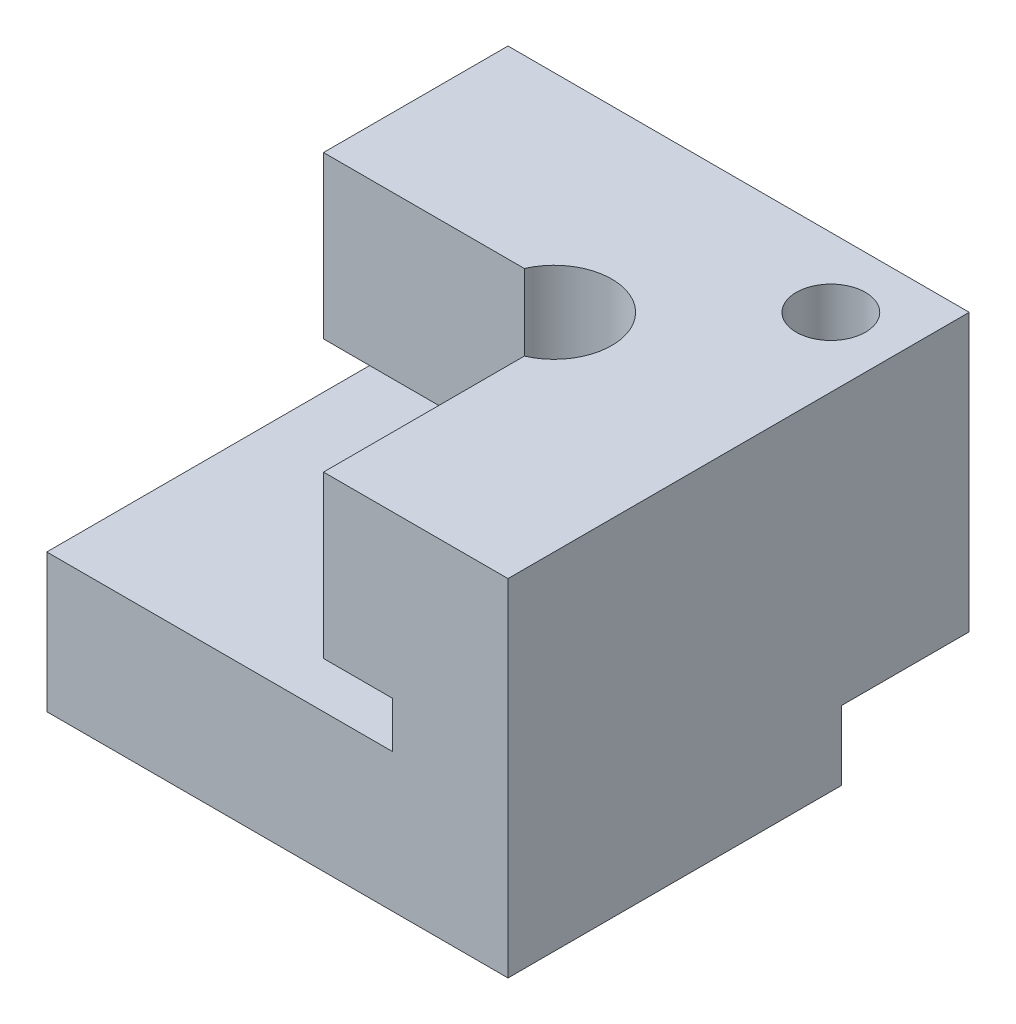
ISO-10303-21;
HEADER;
FILE_DESCRIPTION(('STEP AP214'),'2;1');
FILE_NAME('part.step','',(''),(''),'','','');
FILE_SCHEMA(('AUTOMOTIVE_DESIGN { 1 0 10303 214 1 1 1 1 }'));
ENDSEC;
DATA;
#1=APPLICATION_CONTEXT('core data for automotive mechanical design processes');
#2=APPLICATION_PROTOCOL_DEFINITION('international standard','automotive_design',2000,#1);
#3=PRODUCT_CONTEXT('',#1,'mechanical');
#4=PRODUCT('Part','Part','',(#3));
#5=PRODUCT_RELATED_PRODUCT_CATEGORY('part','',(#4));
#6=PRODUCT_DEFINITION_FORMATION('','',#4);
#7=PRODUCT_DEFINITION_CONTEXT('part definition',#1,'design');
#8=PRODUCT_DEFINITION('design','',#6,#7);
#9=PRODUCT_DEFINITION_SHAPE('','',#8);
#10=(LENGTH_UNIT() NAMED_UNIT(*) SI_UNIT(.MILLI.,.METRE.));
#11=(NAMED_UNIT(*) PLANE_ANGLE_UNIT() SI_UNIT($,.RADIAN.));
#12=(NAMED_UNIT(*) SI_UNIT($,.STERADIAN.) SOLID_ANGLE_UNIT());
#13=UNCERTAINTY_MEASURE_WITH_UNIT(LENGTH_MEASURE(1.E-05),#10,'distance_accuracy_value','');
#14=(GEOMETRIC_REPRESENTATION_CONTEXT(3) GLOBAL_UNCERTAINTY_ASSIGNED_CONTEXT((#13)) GLOBAL_UNIT_ASSIGNED_CONTEXT((#10,
#11,#12)) REPRESENTATION_CONTEXT('',''));
#15=CARTESIAN_POINT('',(0.,0.,0.));
#16=DIRECTION('',(0.,0.,1.));
#17=DIRECTION('',(1.,0.,0.));
#18=AXIS2_PLACEMENT_3D('',#15,#16,#17);
#19=CARTESIAN_POINT('',(17.,0.,-17.));
#20=DIRECTION('',(0.,1.,0.));
#21=DIRECTION('',(0.,0.,1.));
#22=AXIS2_PLACEMENT_3D('',#19,#20,#21);
#23=CYLINDRICAL_SURFACE('',#22,1.5);
#24=CARTESIAN_POINT('',(17.,15.,-17.));
#25=DIRECTION('',(0.,1.,0.));
#26=DIRECTION('',(0.,0.,1.));
#27=AXIS2_PLACEMENT_3D('',#24,#25,#26);
#28=CIRCLE('',#27,1.5);
#29=CARTESIAN_POINT('',(17.,15.,-15.5));
#30=VERTEX_POINT('',#29);
#31=EDGE_CURVE('E253',#30,#30,#28,.T.);
#32=ORIENTED_EDGE('',*,*,#31,.T.);
#33=EDGE_LOOP('',(#32));
#34=FACE_BOUND('',#33,.T.);
#35=CARTESIAN_POINT('',(17.,3.,-17.));
#36=DIRECTION('',(0.,-1.,0.));
#37=DIRECTION('',(0.,0.,-1.));
#38=AXIS2_PLACEMENT_3D('',#35,#36,#37);
#39=CIRCLE('',#38,1.5);
#40=CARTESIAN_POINT('',(17.,3.,-18.5));
#41=VERTEX_POINT('',#40);
#42=EDGE_CURVE('E43',#41,#41,#39,.F.);
#43=ORIENTED_EDGE('',*,*,#42,.F.);
#44=EDGE_LOOP('',(#43));
#45=FACE_BOUND('',#44,.T.);
#46=ADVANCED_FACE('F39',(#34,#45),#23,.F.);
#47=CARTESIAN_POINT('',(11.,0.,-11.));
#48=DIRECTION('',(0.,1.,0.));
#49=DIRECTION('',(0.,0.,1.));
#50=AXIS2_PLACEMENT_3D('',#47,#48,#49);
#51=CYLINDRICAL_SURFACE('',#50,1.5);
#52=CARTESIAN_POINT('',(11.,0.,-11.));
#53=DIRECTION('',(0.,1.,0.));
#54=DIRECTION('',(0.,0.,1.));
#55=AXIS2_PLACEMENT_3D('',#52,#53,#54);
#56=CIRCLE('',#55,1.5);
#57=CARTESIAN_POINT('',(11.,0.,-9.5));
#58=VERTEX_POINT('',#57);
#59=EDGE_CURVE('E254',#58,#58,#56,.T.);
#60=ORIENTED_EDGE('',*,*,#59,.F.);
#61=EDGE_LOOP('',(#60));
#62=FACE_BOUND('',#61,.T.);
#63=CARTESIAN_POINT('',(11.,3.,-11.));
#64=DIRECTION('',(0.,1.,0.));
#65=DIRECTION('',(0.,0.,1.));
#66=AXIS2_PLACEMENT_3D('',#63,#64,#65);
#67=CIRCLE('',#66,1.5);
#68=CARTESIAN_POINT('',(11.,3.,-9.5));
#69=VERTEX_POINT('',#68);
#70=EDGE_CURVE('E240',#69,#69,#67,.F.);
#71=ORIENTED_EDGE('',*,*,#70,.F.);
#72=EDGE_LOOP('',(#71));
#73=FACE_BOUND('',#72,.T.);
#74=ADVANCED_FACE('F366',(#62,#73),#51,.F.);
#75=CARTESIAN_POINT('',(0.,15.,0.));
#76=DIRECTION('',(1.,0.,0.));
#77=DIRECTION('',(0.,0.,-1.));
#78=AXIS2_PLACEMENT_3D('',#75,#76,#77);
#79=PLANE('',#78);
#80=DIRECTION('',(0.,0.,1.));
#81=VECTOR('',#80,1.);
#82=CARTESIAN_POINT('',(0.,6.,0.));
#83=LINE('',#82,#81);
#84=CARTESIAN_POINT('',(0.,6.,-15.));
#85=VERTEX_POINT('',#84);
#86=CARTESIAN_POINT('',(0.,6.,0.));
#87=VERTEX_POINT('',#86);
#88=EDGE_CURVE('E301',#85,#87,#83,.T.);
#89=ORIENTED_EDGE('',*,*,#88,.F.);
#90=DIRECTION('',(0.,-1.,0.));
#91=VECTOR('',#90,1.);
#92=CARTESIAN_POINT('',(0.,6.,-15.));
#93=LINE('',#92,#91);
#94=CARTESIAN_POINT('',(0.,8.,-15.));
#95=VERTEX_POINT('',#94);
#96=EDGE_CURVE('E265',#95,#85,#93,.T.);
#97=ORIENTED_EDGE('',*,*,#96,.F.);
#98=DIRECTION('',(0.,0.,-1.));
#99=VECTOR('',#98,1.);
#100=CARTESIAN_POINT('',(0.,8.,-12.));
#101=LINE('',#100,#99);
#102=CARTESIAN_POINT('',(0.,8.,-12.));
#103=VERTEX_POINT('',#102);
#104=EDGE_CURVE('E258',#103,#95,#101,.T.);
#105=ORIENTED_EDGE('',*,*,#104,.F.);
#106=DIRECTION('',(0.,1.,0.));
#107=VECTOR('',#106,1.);
#108=CARTESIAN_POINT('',(0.,6.,-12.));
#109=LINE('',#108,#107);
#110=CARTESIAN_POINT('',(0.,15.,-12.));
#111=VERTEX_POINT('',#110);
#112=EDGE_CURVE('E313',#103,#111,#109,.T.);
#113=ORIENTED_EDGE('',*,*,#112,.T.);
#114=DIRECTION('',(0.,0.,1.));
#115=VECTOR('',#114,1.);
#116=CARTESIAN_POINT('',(0.,15.,0.));
#117=LINE('',#116,#115);
#118=CARTESIAN_POINT('',(0.,15.,-20.));
#119=VERTEX_POINT('',#118);
#120=EDGE_CURVE('E320',#119,#111,#117,.T.);
#121=ORIENTED_EDGE('',*,*,#120,.F.);
#122=DIRECTION('',(0.,-1.,0.));
#123=VECTOR('',#122,1.);
#124=CARTESIAN_POINT('',(0.,15.,-20.));
#125=LINE('',#124,#123);
#126=CARTESIAN_POINT('',(0.,0.,-20.));
#127=VERTEX_POINT('',#126);
#128=EDGE_CURVE('E334',#119,#127,#125,.T.);
#129=ORIENTED_EDGE('',*,*,#128,.T.);
#130=DIRECTION('',(0.,0.,1.));
#131=VECTOR('',#130,1.);
#132=CARTESIAN_POINT('',(0.,0.,0.));
#133=LINE('',#132,#131);
#134=CARTESIAN_POINT('',(0.,0.,0.));
#135=VERTEX_POINT('',#134);
#136=EDGE_CURVE('E317',#127,#135,#133,.T.);
#137=ORIENTED_EDGE('',*,*,#136,.T.);
#138=DIRECTION('',(0.,-1.,0.));
#139=VECTOR('',#138,1.);
#140=CARTESIAN_POINT('',(0.,15.,0.));
#141=LINE('',#140,#139);
#142=EDGE_CURVE('E49',#87,#135,#141,.T.);
#143=ORIENTED_EDGE('',*,*,#142,.F.);
#144=EDGE_LOOP('',(#89,#97,#105,#113,#121,#129,#137,#143));
#145=FACE_BOUND('',#144,.T.);
#146=ADVANCED_FACE('F41',(#145),#79,.F.);
#147=CARTESIAN_POINT('',(0.,15.,0.));
#148=DIRECTION('',(0.,0.,-1.));
#149=DIRECTION('',(-1.,0.,0.));
#150=AXIS2_PLACEMENT_3D('',#147,#148,#149);
#151=PLANE('',#150);
#152=DIRECTION('',(0.,1.,0.));
#153=VECTOR('',#152,1.);
#154=CARTESIAN_POINT('',(12.,6.,0.));
#155=LINE('',#154,#153);
#156=CARTESIAN_POINT('',(12.,8.,0.));
#157=VERTEX_POINT('',#156);
#158=CARTESIAN_POINT('',(12.,15.,0.));
#159=VERTEX_POINT('',#158);
#160=EDGE_CURVE('E63',#157,#159,#155,.T.);
#161=ORIENTED_EDGE('',*,*,#160,.F.);
#162=DIRECTION('',(-1.,0.,0.));
#163=VECTOR('',#162,1.);
#164=CARTESIAN_POINT('',(12.,8.,0.));
#165=LINE('',#164,#163);
#166=CARTESIAN_POINT('',(15.,8.,0.));
#167=VERTEX_POINT('',#166);
#168=EDGE_CURVE('E278',#167,#157,#165,.T.);
#169=ORIENTED_EDGE('',*,*,#168,.F.);
#170=DIRECTION('',(0.,1.,0.));
#171=VECTOR('',#170,1.);
#172=CARTESIAN_POINT('',(15.,6.,0.));
#173=LINE('',#172,#171);
#174=CARTESIAN_POINT('',(15.,6.,0.));
#175=VERTEX_POINT('',#174);
#176=EDGE_CURVE('E272',#175,#167,#173,.T.);
#177=ORIENTED_EDGE('',*,*,#176,.F.);
#178=DIRECTION('',(1.,0.,0.));
#179=VECTOR('',#178,1.);
#180=CARTESIAN_POINT('',(0.,6.,0.));
#181=LINE('',#180,#179);
#182=EDGE_CURVE('E304',#87,#175,#181,.T.);
#183=ORIENTED_EDGE('',*,*,#182,.F.);
#184=ORIENTED_EDGE('',*,*,#142,.T.);
#185=DIRECTION('',(1.,0.,0.));
#186=VECTOR('',#185,1.);
#187=CARTESIAN_POINT('',(0.,0.,0.));
#188=LINE('',#187,#186);
#189=CARTESIAN_POINT('',(20.,0.,0.));
#190=VERTEX_POINT('',#189);
#191=EDGE_CURVE('E338',#135,#190,#188,.T.);
#192=ORIENTED_EDGE('',*,*,#191,.T.);
#193=DIRECTION('',(0.,-1.,0.));
#194=VECTOR('',#193,1.);
#195=CARTESIAN_POINT('',(20.,15.,0.));
#196=LINE('',#195,#194);
#197=CARTESIAN_POINT('',(20.,15.,0.));
#198=VERTEX_POINT('',#197);
#199=EDGE_CURVE('E354',#198,#190,#196,.T.);
#200=ORIENTED_EDGE('',*,*,#199,.F.);
#201=DIRECTION('',(1.,0.,0.));
#202=VECTOR('',#201,1.);
#203=CARTESIAN_POINT('',(0.,15.,0.));
#204=LINE('',#203,#202);
#205=EDGE_CURVE('E324',#159,#198,#204,.T.);
#206=ORIENTED_EDGE('',*,*,#205,.F.);
#207=EDGE_LOOP('',(#161,#169,#177,#183,#184,#192,#200,#206));
#208=FACE_BOUND('',#207,.T.);
#209=ADVANCED_FACE('F374',(#208),#151,.F.);
#210=CARTESIAN_POINT('',(20.,15.,0.));
#211=DIRECTION('',(-1.,0.,0.));
#212=DIRECTION('',(0.,0.,1.));
#213=AXIS2_PLACEMENT_3D('',#210,#211,#212);
#214=PLANE('',#213);
#215=DIRECTION('',(0.,0.,-1.));
#216=VECTOR('',#215,1.);
#217=CARTESIAN_POINT('',(20.,0.,0.));
#218=LINE('',#217,#216);
#219=CARTESIAN_POINT('',(20.,0.,-14.4706509264683));
#220=VERTEX_POINT('',#219);
#221=EDGE_CURVE('E341',#190,#220,#218,.T.);
#222=ORIENTED_EDGE('',*,*,#221,.T.);
#223=DIRECTION('',(0.,1.,0.));
#224=VECTOR('',#223,1.);
#225=CARTESIAN_POINT('',(20.,15.,-14.4706509264683));
#226=LINE('',#225,#224);
#227=CARTESIAN_POINT('',(20.,3.,-14.4706509264683));
#228=VERTEX_POINT('',#227);
#229=EDGE_CURVE('E215',#220,#228,#226,.T.);
#230=ORIENTED_EDGE('',*,*,#229,.T.);
#231=DIRECTION('',(0.,0.,1.));
#232=VECTOR('',#231,1.);
#233=CARTESIAN_POINT('',(20.,3.,0.));
#234=LINE('',#233,#232);
#235=CARTESIAN_POINT('',(20.,3.,-20.));
#236=VERTEX_POINT('',#235);
#237=EDGE_CURVE('E232',#236,#228,#234,.T.);
#238=ORIENTED_EDGE('',*,*,#237,.F.);
#239=DIRECTION('',(0.,-1.,0.));
#240=VECTOR('',#239,1.);
#241=CARTESIAN_POINT('',(20.,15.,-20.));
#242=LINE('',#241,#240);
#243=CARTESIAN_POINT('',(20.,15.,-20.));
#244=VERTEX_POINT('',#243);
#245=EDGE_CURVE('E350',#244,#236,#242,.T.);
#246=ORIENTED_EDGE('',*,*,#245,.F.);
#247=DIRECTION('',(0.,0.,-1.));
#248=VECTOR('',#247,1.);
#249=CARTESIAN_POINT('',(20.,15.,0.));
#250=LINE('',#249,#248);
#251=EDGE_CURVE('E328',#198,#244,#250,.T.);
#252=ORIENTED_EDGE('',*,*,#251,.F.);
#253=ORIENTED_EDGE('',*,*,#199,.T.);
#254=EDGE_LOOP('',(#222,#230,#238,#246,#252,#253));
#255=FACE_BOUND('',#254,.T.);
#256=ADVANCED_FACE('F417',(#255),#214,.F.);
#257=CARTESIAN_POINT('',(0.,15.,-20.));
#258=DIRECTION('',(0.,0.,1.));
#259=DIRECTION('',(1.,0.,0.));
#260=AXIS2_PLACEMENT_3D('',#257,#258,#259);
#261=PLANE('',#260);
#262=DIRECTION('',(1.,0.,0.));
#263=VECTOR('',#262,1.);
#264=CARTESIAN_POINT('',(20.,3.,-20.));
#265=LINE('',#264,#263);
#266=CARTESIAN_POINT('',(14.7279099348344,3.,-20.));
#267=VERTEX_POINT('',#266);
#268=EDGE_CURVE('E229',#267,#236,#265,.T.);
#269=ORIENTED_EDGE('',*,*,#268,.F.);
#270=DIRECTION('',(0.,-1.,0.));
#271=VECTOR('',#270,1.);
#272=CARTESIAN_POINT('',(14.7279099348344,3.,-20.));
#273=LINE('',#272,#271);
#274=CARTESIAN_POINT('',(14.7279099348344,0.,-20.));
#275=VERTEX_POINT('',#274);
#276=EDGE_CURVE('E220',#267,#275,#273,.T.);
#277=ORIENTED_EDGE('',*,*,#276,.T.);
#278=DIRECTION('',(-1.,0.,0.));
#279=VECTOR('',#278,1.);
#280=CARTESIAN_POINT('',(0.,0.,-20.));
#281=LINE('',#280,#279);
#282=EDGE_CURVE('E325',#275,#127,#281,.T.);
#283=ORIENTED_EDGE('',*,*,#282,.T.);
#284=ORIENTED_EDGE('',*,*,#128,.F.);
#285=DIRECTION('',(-1.,0.,0.));
#286=VECTOR('',#285,1.);
#287=CARTESIAN_POINT('',(0.,15.,-20.));
#288=LINE('',#287,#286);
#289=EDGE_CURVE('E331',#244,#119,#288,.T.);
#290=ORIENTED_EDGE('',*,*,#289,.F.);
#291=ORIENTED_EDGE('',*,*,#245,.T.);
#292=EDGE_LOOP('',(#269,#277,#283,#284,#290,#291));
#293=FACE_BOUND('',#292,.T.);
#294=ADVANCED_FACE('F410',(#293),#261,.F.);
#295=CARTESIAN_POINT('',(0.,15.,0.));
#296=DIRECTION('',(0.,-1.,0.));
#297=DIRECTION('',(0.,0.,-1.));
#298=AXIS2_PLACEMENT_3D('',#295,#296,#297);
#299=PLANE('',#298);
#300=ORIENTED_EDGE('',*,*,#31,.F.);
#301=EDGE_LOOP('',(#300));
#302=FACE_BOUND('',#301,.T.);
#303=DIRECTION('',(-1.,0.,0.));
#304=VECTOR('',#303,1.);
#305=CARTESIAN_POINT('',(0.,15.,-12.));
#306=LINE('',#305,#304);
#307=CARTESIAN_POINT('',(8.70871215252208,15.,-12.));
#308=VERTEX_POINT('',#307);
#309=EDGE_CURVE('E305',#308,#111,#306,.T.);
#310=ORIENTED_EDGE('',*,*,#309,.F.);
#311=CARTESIAN_POINT('',(11.,15.,-11.));
#312=DIRECTION('',(0.,1.,0.));
#313=DIRECTION('',(0.,0.,1.));
#314=AXIS2_PLACEMENT_3D('',#311,#312,#313);
#315=CIRCLE('',#314,2.5);
#316=CARTESIAN_POINT('',(12.,15.,-8.70871215252208));
#317=VERTEX_POINT('',#316);
#318=EDGE_CURVE('E235',#317,#308,#315,.T.);
#319=ORIENTED_EDGE('',*,*,#318,.F.);
#320=DIRECTION('',(0.,0.,-1.));
#321=VECTOR('',#320,1.);
#322=CARTESIAN_POINT('',(12.,15.,0.));
#323=LINE('',#322,#321);
#324=EDGE_CURVE('E295',#159,#317,#323,.T.);
#325=ORIENTED_EDGE('',*,*,#324,.F.);
#326=ORIENTED_EDGE('',*,*,#205,.T.);
#327=ORIENTED_EDGE('',*,*,#251,.T.);
#328=ORIENTED_EDGE('',*,*,#289,.T.);
#329=ORIENTED_EDGE('',*,*,#120,.T.);
#330=EDGE_LOOP('',(#310,#319,#325,#326,#327,#328,#329));
#331=FACE_BOUND('',#330,.T.);
#332=ADVANCED_FACE('F407',(#302,#331),#299,.F.);
#333=CARTESIAN_POINT('',(0.,0.,0.));
#334=DIRECTION('',(0.,-1.,0.));
#335=DIRECTION('',(0.,0.,-1.));
#336=AXIS2_PLACEMENT_3D('',#333,#334,#335);
#337=PLANE('',#336);
#338=DIRECTION('',(-1.,0.,0.));
#339=VECTOR('',#338,1.);
#340=CARTESIAN_POINT('',(19.2720900651656,0.,-14.4706509264683));
#341=LINE('',#340,#339);
#342=CARTESIAN_POINT('',(19.2720900651656,0.,-14.4706509264683));
#343=VERTEX_POINT('',#342);
#344=EDGE_CURVE('E192',#220,#343,#341,.T.);
#345=ORIENTED_EDGE('',*,*,#344,.F.);
#346=ORIENTED_EDGE('',*,*,#221,.F.);
#347=ORIENTED_EDGE('',*,*,#191,.F.);
#348=ORIENTED_EDGE('',*,*,#136,.F.);
#349=ORIENTED_EDGE('',*,*,#282,.F.);
#350=DIRECTION('',(0.,0.,-1.));
#351=VECTOR('',#350,1.);
#352=CARTESIAN_POINT('',(14.7279099348344,0.,-19.5293490735317));
#353=LINE('',#352,#351);
#354=CARTESIAN_POINT('',(14.7279099348344,0.,-19.5293490735317));
#355=VERTEX_POINT('',#354);
#356=EDGE_CURVE('E207',#355,#275,#353,.T.);
#357=ORIENTED_EDGE('',*,*,#356,.F.);
#358=DIRECTION('',(0.310128094157133,0.,-0.95069478026045));
#359=VECTOR('',#358,1.);
#360=CARTESIAN_POINT('',(13.6734744147001,0.,-16.2969868206462));
#361=LINE('',#360,#359);
#362=CARTESIAN_POINT('',(13.6734744147001,0.,-16.2969868206462));
#363=VERTEX_POINT('',#362);
#364=EDGE_CURVE('E204',#363,#355,#361,.T.);
#365=ORIENTED_EDGE('',*,*,#364,.F.);
#366=DIRECTION('',(-0.668261783872247,0.,-0.743926198097555));
#367=VECTOR('',#366,1.);
#368=CARTESIAN_POINT('',(15.9455644798658,0.,-13.7676377471145));
#369=LINE('',#368,#367);
#370=CARTESIAN_POINT('',(15.9455644798658,0.,-13.7676377471145));
#371=VERTEX_POINT('',#370);
#372=EDGE_CURVE('E167',#371,#363,#369,.T.);
#373=ORIENTED_EDGE('',*,*,#372,.F.);
#374=DIRECTION('',(-0.97838987802938,0.,0.206768582162896));
#375=VECTOR('',#374,1.);
#376=CARTESIAN_POINT('',(19.2720900651656,0.,-14.4706509264683));
#377=LINE('',#376,#375);
#378=EDGE_CURVE('E188',#343,#371,#377,.T.);
#379=ORIENTED_EDGE('',*,*,#378,.F.);
#380=EDGE_LOOP('',(#345,#346,#347,#348,#349,#357,#365,#373,#379));
#381=FACE_BOUND('',#380,.T.);
#382=ORIENTED_EDGE('',*,*,#59,.T.);
#383=EDGE_LOOP('',(#382));
#384=FACE_BOUND('',#383,.T.);
#385=ADVANCED_FACE('F403',(#381,#384),#337,.T.);
#386=CARTESIAN_POINT('',(0.,6.,-12.));
#387=DIRECTION('',(0.,0.,-1.));
#388=DIRECTION('',(-1.,0.,0.));
#389=AXIS2_PLACEMENT_3D('',#386,#387,#388);
#390=PLANE('',#389);
#391=DIRECTION('',(-1.,0.,0.));
#392=VECTOR('',#391,1.);
#393=CARTESIAN_POINT('',(15.,8.,-12.));
#394=LINE('',#393,#392);
#395=CARTESIAN_POINT('',(8.70871215252208,8.,-12.));
#396=VERTEX_POINT('',#395);
#397=EDGE_CURVE('E269',#396,#103,#394,.T.);
#398=ORIENTED_EDGE('',*,*,#397,.F.);
#399=DIRECTION('',(0.,1.,0.));
#400=VECTOR('',#399,1.);
#401=CARTESIAN_POINT('',(8.70871215252208,3.,-12.));
#402=LINE('',#401,#400);
#403=EDGE_CURVE('E56',#396,#308,#402,.T.);
#404=ORIENTED_EDGE('',*,*,#403,.T.);
#405=ORIENTED_EDGE('',*,*,#309,.T.);
#406=ORIENTED_EDGE('',*,*,#112,.F.);
#407=EDGE_LOOP('',(#398,#404,#405,#406));
#408=FACE_BOUND('',#407,.T.);
#409=ADVANCED_FACE('F400',(#408),#390,.F.);
#410=CARTESIAN_POINT('',(12.,6.,0.));
#411=DIRECTION('',(1.,0.,0.));
#412=DIRECTION('',(0.,0.,-1.));
#413=AXIS2_PLACEMENT_3D('',#410,#411,#412);
#414=PLANE('',#413);
#415=ORIENTED_EDGE('',*,*,#324,.T.);
#416=DIRECTION('',(0.,1.,0.));
#417=VECTOR('',#416,1.);
#418=CARTESIAN_POINT('',(12.,3.,-8.70871215252208));
#419=LINE('',#418,#417);
#420=CARTESIAN_POINT('',(12.,8.,-8.70871215252208));
#421=VERTEX_POINT('',#420);
#422=EDGE_CURVE('E243',#317,#421,#419,.F.);
#423=ORIENTED_EDGE('',*,*,#422,.T.);
#424=DIRECTION('',(0.,0.,1.));
#425=VECTOR('',#424,1.);
#426=CARTESIAN_POINT('',(12.,8.,-15.));
#427=LINE('',#426,#425);
#428=EDGE_CURVE('E292',#421,#157,#427,.T.);
#429=ORIENTED_EDGE('',*,*,#428,.T.);
#430=ORIENTED_EDGE('',*,*,#160,.T.);
#431=EDGE_LOOP('',(#415,#423,#429,#430));
#432=FACE_BOUND('',#431,.T.);
#433=ADVANCED_FACE('F398',(#432),#414,.F.);
#434=CARTESIAN_POINT('',(0.,6.,0.));
#435=DIRECTION('',(0.,-1.,0.));
#436=DIRECTION('',(0.,0.,-1.));
#437=AXIS2_PLACEMENT_3D('',#434,#435,#436);
#438=PLANE('',#437);
#439=CARTESIAN_POINT('',(11.,6.,-11.));
#440=DIRECTION('',(0.,-1.,0.));
#441=DIRECTION('',(0.,0.,-1.));
#442=AXIS2_PLACEMENT_3D('',#439,#440,#441);
#443=CIRCLE('',#442,2.5);
#444=CARTESIAN_POINT('',(11.,6.,-13.5));
#445=VERTEX_POINT('',#444);
#446=EDGE_CURVE('E249',#445,#445,#443,.T.);
#447=ORIENTED_EDGE('',*,*,#446,.T.);
#448=EDGE_LOOP('',(#447));
#449=FACE_BOUND('',#448,.T.);
#450=ORIENTED_EDGE('',*,*,#182,.T.);
#451=DIRECTION('',(0.,0.,1.));
#452=VECTOR('',#451,1.);
#453=CARTESIAN_POINT('',(15.,6.,-15.));
#454=LINE('',#453,#452);
#455=CARTESIAN_POINT('',(15.,6.,-15.));
#456=VERTEX_POINT('',#455);
#457=EDGE_CURVE('E285',#456,#175,#454,.T.);
#458=ORIENTED_EDGE('',*,*,#457,.F.);
#459=DIRECTION('',(1.,0.,0.));
#460=VECTOR('',#459,1.);
#461=CARTESIAN_POINT('',(12.,6.,-15.));
#462=LINE('',#461,#460);
#463=EDGE_CURVE('E273',#85,#456,#462,.T.);
#464=ORIENTED_EDGE('',*,*,#463,.F.);
#465=ORIENTED_EDGE('',*,*,#88,.T.);
#466=EDGE_LOOP('',(#450,#458,#464,#465));
#467=FACE_BOUND('',#466,.T.);
#468=ADVANCED_FACE('F391',(#449,#467),#438,.F.);
#469=CARTESIAN_POINT('',(12.,8.,-15.));
#470=DIRECTION('',(0.,1.,0.));
#471=DIRECTION('',(-1.,0.,0.));
#472=AXIS2_PLACEMENT_3D('',#469,#470,#471);
#473=PLANE('',#472);
#474=ORIENTED_EDGE('',*,*,#428,.F.);
#475=CARTESIAN_POINT('',(11.,8.,-11.));
#476=DIRECTION('',(0.,1.,0.));
#477=DIRECTION('',(-1.,0.,0.));
#478=AXIS2_PLACEMENT_3D('',#475,#476,#477);
#479=CIRCLE('',#478,2.5);
#480=EDGE_CURVE('E11',#421,#396,#479,.T.);
#481=ORIENTED_EDGE('',*,*,#480,.T.);
#482=ORIENTED_EDGE('',*,*,#397,.T.);
#483=ORIENTED_EDGE('',*,*,#104,.T.);
#484=DIRECTION('',(-1.,0.,0.));
#485=VECTOR('',#484,1.);
#486=CARTESIAN_POINT('',(12.,8.,-15.));
#487=LINE('',#486,#485);
#488=CARTESIAN_POINT('',(15.,8.,-15.));
#489=VERTEX_POINT('',#488);
#490=EDGE_CURVE('E282',#489,#95,#487,.T.);
#491=ORIENTED_EDGE('',*,*,#490,.F.);
#492=DIRECTION('',(0.,0.,1.));
#493=VECTOR('',#492,1.);
#494=CARTESIAN_POINT('',(15.,8.,-15.));
#495=LINE('',#494,#493);
#496=EDGE_CURVE('E296',#489,#167,#495,.T.);
#497=ORIENTED_EDGE('',*,*,#496,.T.);
#498=ORIENTED_EDGE('',*,*,#168,.T.);
#499=EDGE_LOOP('',(#474,#481,#482,#483,#491,#497,#498));
#500=FACE_BOUND('',#499,.T.);
#501=ADVANCED_FACE('F388',(#500),#473,.F.);
#502=CARTESIAN_POINT('',(15.,6.,-15.));
#503=DIRECTION('',(1.,0.,0.));
#504=DIRECTION('',(0.,0.,-1.));
#505=AXIS2_PLACEMENT_3D('',#502,#503,#504);
#506=PLANE('',#505);
#507=ORIENTED_EDGE('',*,*,#176,.T.);
#508=ORIENTED_EDGE('',*,*,#496,.F.);
#509=DIRECTION('',(0.,1.,0.));
#510=VECTOR('',#509,1.);
#511=CARTESIAN_POINT('',(15.,6.,-15.));
#512=LINE('',#511,#510);
#513=EDGE_CURVE('E277',#456,#489,#512,.T.);
#514=ORIENTED_EDGE('',*,*,#513,.F.);
#515=ORIENTED_EDGE('',*,*,#457,.T.);
#516=EDGE_LOOP('',(#507,#508,#514,#515));
#517=FACE_BOUND('',#516,.T.);
#518=ADVANCED_FACE('F386',(#517),#506,.F.);
#519=CARTESIAN_POINT('',(0.,0.,-15.));
#520=DIRECTION('',(0.,0.,-1.));
#521=DIRECTION('',(-1.,0.,0.));
#522=AXIS2_PLACEMENT_3D('',#519,#520,#521);
#523=PLANE('',#522);
#524=ORIENTED_EDGE('',*,*,#490,.T.);
#525=ORIENTED_EDGE('',*,*,#96,.T.);
#526=ORIENTED_EDGE('',*,*,#463,.T.);
#527=ORIENTED_EDGE('',*,*,#513,.T.);
#528=EDGE_LOOP('',(#524,#525,#526,#527));
#529=FACE_BOUND('',#528,.T.);
#530=ADVANCED_FACE('F383',(#529),#523,.F.);
#531=CARTESIAN_POINT('',(11.,3.,-11.));
#532=DIRECTION('',(0.,1.,0.));
#533=DIRECTION('',(0.,0.,1.));
#534=AXIS2_PLACEMENT_3D('',#531,#532,#533);
#535=PLANE('',#534);
#536=CARTESIAN_POINT('',(11.,3.,-11.));
#537=DIRECTION('',(0.,1.,0.));
#538=DIRECTION('',(0.,0.,1.));
#539=AXIS2_PLACEMENT_3D('',#536,#537,#538);
#540=CIRCLE('',#539,2.5);
#541=CARTESIAN_POINT('',(11.,3.,-8.5));
#542=VERTEX_POINT('',#541);
#543=EDGE_CURVE('E236',#542,#542,#540,.T.);
#544=ORIENTED_EDGE('',*,*,#543,.T.);
#545=EDGE_LOOP('',(#544));
#546=FACE_BOUND('',#545,.T.);
#547=ORIENTED_EDGE('',*,*,#70,.T.);
#548=EDGE_LOOP('',(#547));
#549=FACE_BOUND('',#548,.T.);
#550=ADVANCED_FACE('F364',(#546,#549),#535,.T.);
#551=CARTESIAN_POINT('',(11.,3.,-11.));
#552=DIRECTION('',(0.,1.,0.));
#553=DIRECTION('',(0.,0.,1.));
#554=AXIS2_PLACEMENT_3D('',#551,#552,#553);
#555=CYLINDRICAL_SURFACE('',#554,2.5);
#556=ORIENTED_EDGE('',*,*,#543,.F.);
#557=EDGE_LOOP('',(#556));
#558=FACE_BOUND('',#557,.T.);
#559=ORIENTED_EDGE('',*,*,#446,.F.);
#560=EDGE_LOOP('',(#559));
#561=FACE_BOUND('',#560,.T.);
#562=ADVANCED_FACE('F380',(#558,#561),#555,.F.);
#563=ORIENTED_EDGE('',*,*,#480,.F.);
#564=ORIENTED_EDGE('',*,*,#422,.F.);
#565=ORIENTED_EDGE('',*,*,#318,.T.);
#566=ORIENTED_EDGE('',*,*,#403,.F.);
#567=EDGE_LOOP('',(#563,#564,#565,#566));
#568=FACE_BOUND('',#567,.T.);
#569=ADVANCED_FACE('F480',(#568),#555,.F.);
#570=CARTESIAN_POINT('',(0.,3.,0.));
#571=DIRECTION('',(0.,-1.,0.));
#572=DIRECTION('',(0.,0.,-1.));
#573=AXIS2_PLACEMENT_3D('',#570,#571,#572);
#574=PLANE('',#573);
#575=ORIENTED_EDGE('',*,*,#237,.T.);
#576=DIRECTION('',(-1.,0.,0.));
#577=VECTOR('',#576,1.);
#578=CARTESIAN_POINT('',(19.2720900651656,3.,-14.4706509264683));
#579=LINE('',#578,#577);
#580=CARTESIAN_POINT('',(19.2720900651656,3.,-14.4706509264683));
#581=VERTEX_POINT('',#580);
#582=EDGE_CURVE('E197',#228,#581,#579,.T.);
#583=ORIENTED_EDGE('',*,*,#582,.T.);
#584=DIRECTION('',(-0.97838987802938,0.,0.206768582162896));
#585=VECTOR('',#584,1.);
#586=CARTESIAN_POINT('',(19.2720900651656,3.,-14.4706509264683));
#587=LINE('',#586,#585);
#588=CARTESIAN_POINT('',(15.9455644798658,3.,-13.7676377471145));
#589=VERTEX_POINT('',#588);
#590=EDGE_CURVE('E173',#581,#589,#587,.T.);
#591=ORIENTED_EDGE('',*,*,#590,.T.);
#592=DIRECTION('',(-0.668261783872247,0.,-0.743926198097555));
#593=VECTOR('',#592,1.);
#594=CARTESIAN_POINT('',(15.9455644798658,3.,-13.7676377471145));
#595=LINE('',#594,#593);
#596=CARTESIAN_POINT('',(13.6734744147001,3.,-16.2969868206462));
#597=VERTEX_POINT('',#596);
#598=EDGE_CURVE('E164',#589,#597,#595,.T.);
#599=ORIENTED_EDGE('',*,*,#598,.T.);
#600=DIRECTION('',(0.310128094157133,0.,-0.95069478026045));
#601=VECTOR('',#600,1.);
#602=CARTESIAN_POINT('',(13.6734744147001,3.,-16.2969868206462));
#603=LINE('',#602,#601);
#604=CARTESIAN_POINT('',(14.7279099348344,3.,-19.5293490735317));
#605=VERTEX_POINT('',#604);
#606=EDGE_CURVE('E176',#597,#605,#603,.T.);
#607=ORIENTED_EDGE('',*,*,#606,.T.);
#608=DIRECTION('',(0.,0.,-1.));
#609=VECTOR('',#608,1.);
#610=CARTESIAN_POINT('',(14.7279099348344,3.,-19.5293490735317));
#611=LINE('',#610,#609);
#612=EDGE_CURVE('E182',#605,#267,#611,.T.);
#613=ORIENTED_EDGE('',*,*,#612,.T.);
#614=ORIENTED_EDGE('',*,*,#268,.T.);
#615=EDGE_LOOP('',(#575,#583,#591,#599,#607,#613,#614));
#616=FACE_BOUND('',#615,.T.);
#617=ORIENTED_EDGE('',*,*,#42,.T.);
#618=EDGE_LOOP('',(#617));
#619=FACE_BOUND('',#618,.T.);
#620=ADVANCED_FACE('F184',(#616,#619),#574,.T.);
#621=CARTESIAN_POINT('',(19.2720900651656,3.,-14.4706509264683));
#622=DIRECTION('',(0.,0.,1.));
#623=DIRECTION('',(1.,0.,0.));
#624=AXIS2_PLACEMENT_3D('',#621,#622,#623);
#625=PLANE('',#624);
#626=ORIENTED_EDGE('',*,*,#344,.T.);
#627=DIRECTION('',(0.,-1.,0.));
#628=VECTOR('',#627,1.);
#629=CARTESIAN_POINT('',(19.2720900651656,3.,-14.4706509264683));
#630=LINE('',#629,#628);
#631=EDGE_CURVE('E216',#581,#343,#630,.T.);
#632=ORIENTED_EDGE('',*,*,#631,.F.);
#633=ORIENTED_EDGE('',*,*,#582,.F.);
#634=ORIENTED_EDGE('',*,*,#229,.F.);
#635=EDGE_LOOP('',(#626,#632,#633,#634));
#636=FACE_BOUND('',#635,.T.);
#637=ADVANCED_FACE('F462',(#636),#625,.F.);
#638=CARTESIAN_POINT('',(15.9455644798658,3.,-13.7676377471145));
#639=DIRECTION('',(-0.743926198097554,0.,0.668261783872247));
#640=DIRECTION('',(0.668261783872247,0.,0.743926198097555));
#641=AXIS2_PLACEMENT_3D('',#638,#639,#640);
#642=PLANE('',#641);
#643=ORIENTED_EDGE('',*,*,#372,.T.);
#644=DIRECTION('',(0.,-1.,0.));
#645=VECTOR('',#644,1.);
#646=CARTESIAN_POINT('',(13.6734744147001,3.,-16.2969868206462));
#647=LINE('',#646,#645);
#648=EDGE_CURVE('E160',#597,#363,#647,.T.);
#649=ORIENTED_EDGE('',*,*,#648,.F.);
#650=ORIENTED_EDGE('',*,*,#598,.F.);
#651=DIRECTION('',(0.,-1.,0.));
#652=VECTOR('',#651,1.);
#653=CARTESIAN_POINT('',(15.9455644798658,3.,-13.7676377471145));
#654=LINE('',#653,#652);
#655=EDGE_CURVE('E212',#589,#371,#654,.T.);
#656=ORIENTED_EDGE('',*,*,#655,.T.);
#657=EDGE_LOOP('',(#643,#649,#650,#656));
#658=FACE_BOUND('',#657,.T.);
#659=ADVANCED_FACE('F162',(#658),#642,.F.);
#660=CARTESIAN_POINT('',(19.2720900651656,3.,-14.4706509264683));
#661=DIRECTION('',(0.206768582162896,0.,0.97838987802938));
#662=DIRECTION('',(0.97838987802938,0.,-0.206768582162896));
#663=AXIS2_PLACEMENT_3D('',#660,#661,#662);
#664=PLANE('',#663);
#665=ORIENTED_EDGE('',*,*,#378,.T.);
#666=ORIENTED_EDGE('',*,*,#655,.F.);
#667=ORIENTED_EDGE('',*,*,#590,.F.);
#668=ORIENTED_EDGE('',*,*,#631,.T.);
#669=EDGE_LOOP('',(#665,#666,#667,#668));
#670=FACE_BOUND('',#669,.T.);
#671=ADVANCED_FACE('F465',(#670),#664,.F.);
#672=CARTESIAN_POINT('',(14.7279099348344,3.,-19.5293490735317));
#673=DIRECTION('',(-1.,0.,0.));
#674=DIRECTION('',(0.,0.,1.));
#675=AXIS2_PLACEMENT_3D('',#672,#673,#674);
#676=PLANE('',#675);
#677=ORIENTED_EDGE('',*,*,#356,.T.);
#678=ORIENTED_EDGE('',*,*,#276,.F.);
#679=ORIENTED_EDGE('',*,*,#612,.F.);
#680=DIRECTION('',(0.,-1.,0.));
#681=VECTOR('',#680,1.);
#682=CARTESIAN_POINT('',(14.7279099348344,3.,-19.5293490735317));
#683=LINE('',#682,#681);
#684=EDGE_CURVE('E172',#605,#355,#683,.T.);
#685=ORIENTED_EDGE('',*,*,#684,.T.);
#686=EDGE_LOOP('',(#677,#678,#679,#685));
#687=FACE_BOUND('',#686,.T.);
#688=ADVANCED_FACE('F458',(#687),#676,.F.);
#689=CARTESIAN_POINT('',(13.6734744147001,3.,-16.2969868206462));
#690=DIRECTION('',(-0.95069478026045,0.,-0.310128094157133));
#691=DIRECTION('',(-0.310128094157133,0.,0.95069478026045));
#692=AXIS2_PLACEMENT_3D('',#689,#690,#691);
#693=PLANE('',#692);
#694=ORIENTED_EDGE('',*,*,#364,.T.);
#695=ORIENTED_EDGE('',*,*,#684,.F.);
#696=ORIENTED_EDGE('',*,*,#606,.F.);
#697=ORIENTED_EDGE('',*,*,#648,.T.);
#698=EDGE_LOOP('',(#694,#695,#696,#697));
#699=FACE_BOUND('',#698,.T.);
#700=ADVANCED_FACE('F177',(#699),#693,.F.);
#701=CLOSED_SHELL('',(#46,#74,#146,#209,#256,#294,#332,#385,#409,#433,#468,#501,#518,#530,#550,
#562,#569,#620,#637,#659,#671,#688,#700));
#702=MANIFOLD_SOLID_BREP('B2',#701);
#703=ADVANCED_BREP_SHAPE_REPRESENTATION('',(#18,#702),#14);
#704=SHAPE_DEFINITION_REPRESENTATION(#9,#703);
ENDSEC;
END-ISO-10303-21;
